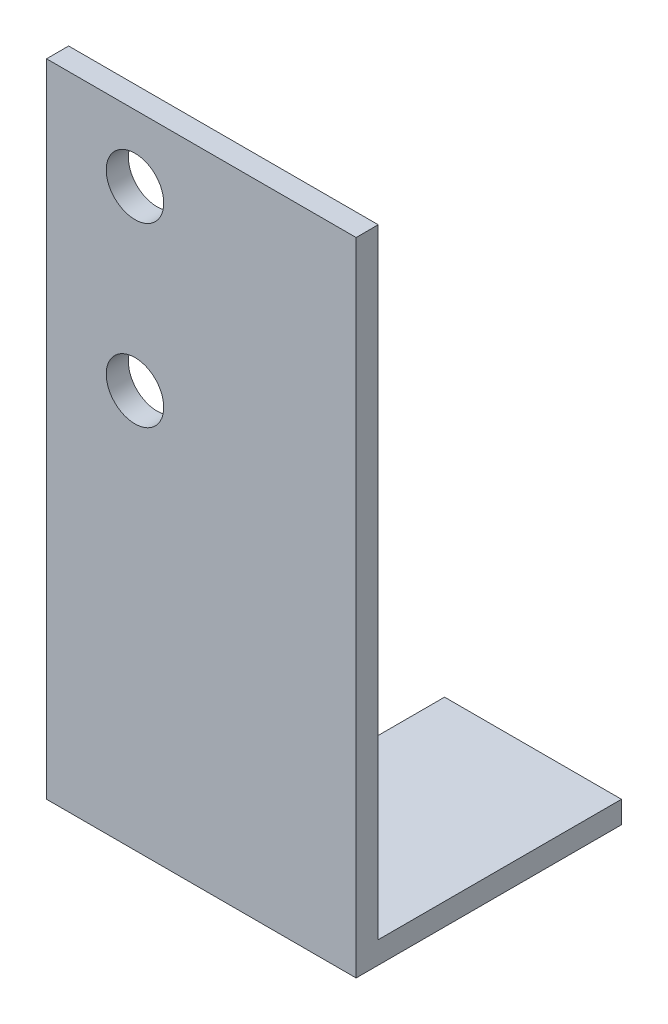
ISO-10303-21;
HEADER;
FILE_DESCRIPTION(('STEP AP214'),'2;1');
FILE_NAME('part.step','',(''),(''),'','','');
FILE_SCHEMA(('AUTOMOTIVE_DESIGN { 1 0 10303 214 1 1 1 1 }'));
ENDSEC;
DATA;
#1=APPLICATION_CONTEXT('core data for automotive mechanical design processes');
#2=APPLICATION_PROTOCOL_DEFINITION('international standard','automotive_design',2000,#1);
#3=PRODUCT_CONTEXT('',#1,'mechanical');
#4=PRODUCT('Part','Part','',(#3));
#5=PRODUCT_RELATED_PRODUCT_CATEGORY('part','',(#4));
#6=PRODUCT_DEFINITION_FORMATION('','',#4);
#7=PRODUCT_DEFINITION_CONTEXT('part definition',#1,'design');
#8=PRODUCT_DEFINITION('design','',#6,#7);
#9=PRODUCT_DEFINITION_SHAPE('','',#8);
#10=(LENGTH_UNIT() NAMED_UNIT(*) SI_UNIT(.MILLI.,.METRE.));
#11=(NAMED_UNIT(*) PLANE_ANGLE_UNIT() SI_UNIT($,.RADIAN.));
#12=(NAMED_UNIT(*) SI_UNIT($,.STERADIAN.) SOLID_ANGLE_UNIT());
#13=UNCERTAINTY_MEASURE_WITH_UNIT(LENGTH_MEASURE(1.E-05),#10,'distance_accuracy_value','');
#14=(GEOMETRIC_REPRESENTATION_CONTEXT(3) GLOBAL_UNCERTAINTY_ASSIGNED_CONTEXT((#13)) GLOBAL_UNIT_ASSIGNED_CONTEXT((#10,
#11,#12)) REPRESENTATION_CONTEXT('',''));
#15=CARTESIAN_POINT('',(0.,0.,0.));
#16=DIRECTION('',(0.,0.,1.));
#17=DIRECTION('',(1.,0.,0.));
#18=AXIS2_PLACEMENT_3D('',#15,#16,#17);
#19=CARTESIAN_POINT('',(14.,29.,0.));
#20=DIRECTION('',(0.,0.,-1.));
#21=DIRECTION('',(0.,1.,0.));
#22=AXIS2_PLACEMENT_3D('',#19,#20,#21);
#23=PLANE('',#22);
#24=CARTESIAN_POINT('',(4.,18.,0.));
#25=DIRECTION('',(0.,0.,1.));
#26=DIRECTION('',(1.,0.,0.));
#27=AXIS2_PLACEMENT_3D('',#24,#25,#26);
#28=CIRCLE('',#27,1.3);
#29=CARTESIAN_POINT('',(5.3,18.,0.));
#30=VERTEX_POINT('',#29);
#31=EDGE_CURVE('E144',#30,#30,#28,.T.);
#32=ORIENTED_EDGE('',*,*,#31,.F.);
#33=EDGE_LOOP('',(#32));
#34=FACE_BOUND('',#33,.T.);
#35=CARTESIAN_POINT('',(4.,26.,0.));
#36=DIRECTION('',(0.,0.,1.));
#37=DIRECTION('',(1.,0.,0.));
#38=AXIS2_PLACEMENT_3D('',#35,#36,#37);
#39=CIRCLE('',#38,1.3);
#40=CARTESIAN_POINT('',(5.3,26.,0.));
#41=VERTEX_POINT('',#40);
#42=EDGE_CURVE('E136',#41,#41,#39,.T.);
#43=ORIENTED_EDGE('',*,*,#42,.F.);
#44=EDGE_LOOP('',(#43));
#45=FACE_BOUND('',#44,.T.);
#46=DIRECTION('',(0.,-1.,0.));
#47=VECTOR('',#46,1.);
#48=CARTESIAN_POINT('',(0.,29.,0.));
#49=LINE('',#48,#47);
#50=CARTESIAN_POINT('',(0.,29.,0.));
#51=VERTEX_POINT('',#50);
#52=CARTESIAN_POINT('',(0.,0.,0.));
#53=VERTEX_POINT('',#52);
#54=EDGE_CURVE('E121',#51,#53,#49,.T.);
#55=ORIENTED_EDGE('',*,*,#54,.T.);
#56=DIRECTION('',(-1.,0.,0.));
#57=VECTOR('',#56,1.);
#58=CARTESIAN_POINT('',(14.,0.,0.));
#59=LINE('',#58,#57);
#60=CARTESIAN_POINT('',(14.,0.,0.));
#61=VERTEX_POINT('',#60);
#62=EDGE_CURVE('E11',#61,#53,#59,.T.);
#63=ORIENTED_EDGE('',*,*,#62,.F.);
#64=DIRECTION('',(0.,-1.,0.));
#65=VECTOR('',#64,1.);
#66=CARTESIAN_POINT('',(14.,29.,0.));
#67=LINE('',#66,#65);
#68=CARTESIAN_POINT('',(14.,29.,0.));
#69=VERTEX_POINT('',#68);
#70=EDGE_CURVE('E130',#69,#61,#67,.T.);
#71=ORIENTED_EDGE('',*,*,#70,.F.);
#72=DIRECTION('',(-1.,0.,0.));
#73=VECTOR('',#72,1.);
#74=CARTESIAN_POINT('',(14.,29.,0.));
#75=LINE('',#74,#73);
#76=EDGE_CURVE('E117',#69,#51,#75,.T.);
#77=ORIENTED_EDGE('',*,*,#76,.T.);
#78=EDGE_LOOP('',(#55,#63,#71,#77));
#79=FACE_BOUND('',#78,.T.);
#80=ADVANCED_FACE('F33',(#34,#45,#79),#23,.F.);
#81=CARTESIAN_POINT('',(14.,0.,0.));
#82=DIRECTION('',(0.,1.,0.));
#83=DIRECTION('',(0.,0.,1.));
#84=AXIS2_PLACEMENT_3D('',#81,#82,#83);
#85=PLANE('',#84);
#86=DIRECTION('',(1.,0.,0.));
#87=VECTOR('',#86,1.);
#88=CARTESIAN_POINT('',(0.,0.,-1.));
#89=LINE('',#88,#87);
#90=CARTESIAN_POINT('',(0.,0.,-1.));
#91=VERTEX_POINT('',#90);
#92=CARTESIAN_POINT('',(6.,0.,-1.));
#93=VERTEX_POINT('',#92);
#94=EDGE_CURVE('E172',#91,#93,#89,.T.);
#95=ORIENTED_EDGE('',*,*,#94,.T.);
#96=DIRECTION('',(0.,0.,-1.));
#97=VECTOR('',#96,1.);
#98=CARTESIAN_POINT('',(6.,0.,-12.));
#99=LINE('',#98,#97);
#100=CARTESIAN_POINT('',(6.,0.,-12.));
#101=VERTEX_POINT('',#100);
#102=EDGE_CURVE('E155',#93,#101,#99,.T.);
#103=ORIENTED_EDGE('',*,*,#102,.T.);
#104=DIRECTION('',(-1.,0.,0.));
#105=VECTOR('',#104,1.);
#106=CARTESIAN_POINT('',(14.,0.,-12.));
#107=LINE('',#106,#105);
#108=CARTESIAN_POINT('',(14.,0.,-12.));
#109=VERTEX_POINT('',#108);
#110=EDGE_CURVE('E41',#109,#101,#107,.T.);
#111=ORIENTED_EDGE('',*,*,#110,.F.);
#112=DIRECTION('',(0.,0.,-1.));
#113=VECTOR('',#112,1.);
#114=CARTESIAN_POINT('',(14.,0.,0.));
#115=LINE('',#114,#113);
#116=EDGE_CURVE('E81',#61,#109,#115,.T.);
#117=ORIENTED_EDGE('',*,*,#116,.F.);
#118=ORIENTED_EDGE('',*,*,#62,.T.);
#119=DIRECTION('',(0.,0.,-1.));
#120=VECTOR('',#119,1.);
#121=CARTESIAN_POINT('',(0.,0.,0.));
#122=LINE('',#121,#120);
#123=EDGE_CURVE('E124',#53,#91,#122,.T.);
#124=ORIENTED_EDGE('',*,*,#123,.T.);
#125=EDGE_LOOP('',(#95,#103,#111,#117,#118,#124));
#126=FACE_BOUND('',#125,.T.);
#127=ADVANCED_FACE('F153',(#126),#85,.F.);
#128=CARTESIAN_POINT('',(14.,0.,-12.));
#129=DIRECTION('',(0.,0.,1.));
#130=DIRECTION('',(1.,0.,0.));
#131=AXIS2_PLACEMENT_3D('',#128,#129,#130);
#132=PLANE('',#131);
#133=ORIENTED_EDGE('',*,*,#110,.T.);
#134=DIRECTION('',(0.,1.,0.));
#135=VECTOR('',#134,1.);
#136=CARTESIAN_POINT('',(6.,0.,-12.));
#137=LINE('',#136,#135);
#138=CARTESIAN_POINT('',(6.,1.,-12.));
#139=VERTEX_POINT('',#138);
#140=EDGE_CURVE('E160',#101,#139,#137,.T.);
#141=ORIENTED_EDGE('',*,*,#140,.T.);
#142=DIRECTION('',(-1.,0.,0.));
#143=VECTOR('',#142,1.);
#144=CARTESIAN_POINT('',(14.,1.,-12.));
#145=LINE('',#144,#143);
#146=CARTESIAN_POINT('',(14.,1.,-12.));
#147=VERTEX_POINT('',#146);
#148=EDGE_CURVE('E112',#147,#139,#145,.T.);
#149=ORIENTED_EDGE('',*,*,#148,.F.);
#150=DIRECTION('',(0.,1.,0.));
#151=VECTOR('',#150,1.);
#152=CARTESIAN_POINT('',(14.,0.,-12.));
#153=LINE('',#152,#151);
#154=EDGE_CURVE('E98',#109,#147,#153,.T.);
#155=ORIENTED_EDGE('',*,*,#154,.F.);
#156=EDGE_LOOP('',(#133,#141,#149,#155));
#157=FACE_BOUND('',#156,.T.);
#158=ADVANCED_FACE('F158',(#157),#132,.F.);
#159=CARTESIAN_POINT('',(14.,1.,-12.));
#160=DIRECTION('',(0.,-1.,0.));
#161=DIRECTION('',(0.,0.,-1.));
#162=AXIS2_PLACEMENT_3D('',#159,#160,#161);
#163=PLANE('',#162);
#164=ORIENTED_EDGE('',*,*,#148,.T.);
#165=DIRECTION('',(0.,0.,-1.));
#166=VECTOR('',#165,1.);
#167=CARTESIAN_POINT('',(6.,1.,-12.));
#168=LINE('',#167,#166);
#169=CARTESIAN_POINT('',(6.,0.999999999999999,-1.));
#170=VERTEX_POINT('',#169);
#171=EDGE_CURVE('E109',#170,#139,#168,.T.);
#172=ORIENTED_EDGE('',*,*,#171,.F.);
#173=DIRECTION('',(-1.,0.,0.));
#174=VECTOR('',#173,1.);
#175=CARTESIAN_POINT('',(14.,0.999999999999999,-1.));
#176=LINE('',#175,#174);
#177=CARTESIAN_POINT('',(14.,0.999999999999999,-1.));
#178=VERTEX_POINT('',#177);
#179=EDGE_CURVE('E105',#178,#170,#176,.T.);
#180=ORIENTED_EDGE('',*,*,#179,.F.);
#181=DIRECTION('',(0.,0.,1.));
#182=VECTOR('',#181,1.);
#183=CARTESIAN_POINT('',(14.,1.,-12.));
#184=LINE('',#183,#182);
#185=EDGE_CURVE('E91',#147,#178,#184,.T.);
#186=ORIENTED_EDGE('',*,*,#185,.F.);
#187=EDGE_LOOP('',(#164,#172,#180,#186));
#188=FACE_BOUND('',#187,.T.);
#189=ADVANCED_FACE('F106',(#188),#163,.F.);
#190=CARTESIAN_POINT('',(14.,0.999999999999999,-1.));
#191=DIRECTION('',(0.,0.,1.));
#192=DIRECTION('',(0.,-1.,0.));
#193=AXIS2_PLACEMENT_3D('',#190,#191,#192);
#194=PLANE('',#193);
#195=CARTESIAN_POINT('',(4.,18.,-1.));
#196=DIRECTION('',(0.,0.,1.));
#197=DIRECTION('',(0.,-1.,0.));
#198=AXIS2_PLACEMENT_3D('',#195,#196,#197);
#199=CIRCLE('',#198,1.3);
#200=CARTESIAN_POINT('',(4.,16.7,-1.));
#201=VERTEX_POINT('',#200);
#202=EDGE_CURVE('E36',#201,#201,#199,.T.);
#203=ORIENTED_EDGE('',*,*,#202,.T.);
#204=EDGE_LOOP('',(#203));
#205=FACE_BOUND('',#204,.T.);
#206=CARTESIAN_POINT('',(4.,26.,-1.));
#207=DIRECTION('',(0.,0.,1.));
#208=DIRECTION('',(0.,-1.,0.));
#209=AXIS2_PLACEMENT_3D('',#206,#207,#208);
#210=CIRCLE('',#209,1.3);
#211=CARTESIAN_POINT('',(4.,24.7,-1.));
#212=VERTEX_POINT('',#211);
#213=EDGE_CURVE('E125',#212,#212,#210,.T.);
#214=ORIENTED_EDGE('',*,*,#213,.T.);
#215=EDGE_LOOP('',(#214));
#216=FACE_BOUND('',#215,.T.);
#217=DIRECTION('',(0.,1.,0.));
#218=VECTOR('',#217,1.);
#219=CARTESIAN_POINT('',(0.,0.999999999999999,-1.));
#220=LINE('',#219,#218);
#221=CARTESIAN_POINT('',(0.,29.,-1.));
#222=VERTEX_POINT('',#221);
#223=EDGE_CURVE('E49',#91,#222,#220,.T.);
#224=ORIENTED_EDGE('',*,*,#223,.T.);
#225=DIRECTION('',(-1.,0.,0.));
#226=VECTOR('',#225,1.);
#227=CARTESIAN_POINT('',(14.,29.,-1.));
#228=LINE('',#227,#226);
#229=CARTESIAN_POINT('',(14.,29.,-1.));
#230=VERTEX_POINT('',#229);
#231=EDGE_CURVE('E113',#230,#222,#228,.T.);
#232=ORIENTED_EDGE('',*,*,#231,.F.);
#233=DIRECTION('',(0.,1.,0.));
#234=VECTOR('',#233,1.);
#235=CARTESIAN_POINT('',(14.,0.999999999999999,-1.));
#236=LINE('',#235,#234);
#237=EDGE_CURVE('E95',#178,#230,#236,.T.);
#238=ORIENTED_EDGE('',*,*,#237,.F.);
#239=ORIENTED_EDGE('',*,*,#179,.T.);
#240=DIRECTION('',(0.,1.,0.));
#241=VECTOR('',#240,1.);
#242=CARTESIAN_POINT('',(6.,0.,-1.));
#243=LINE('',#242,#241);
#244=EDGE_CURVE('E165',#93,#170,#243,.T.);
#245=ORIENTED_EDGE('',*,*,#244,.F.);
#246=ORIENTED_EDGE('',*,*,#94,.F.);
#247=EDGE_LOOP('',(#224,#232,#238,#239,#245,#246));
#248=FACE_BOUND('',#247,.T.);
#249=ADVANCED_FACE('F115',(#205,#216,#248),#194,.F.);
#250=CARTESIAN_POINT('',(14.,29.,-1.));
#251=DIRECTION('',(0.,-1.,0.));
#252=DIRECTION('',(0.,0.,-1.));
#253=AXIS2_PLACEMENT_3D('',#250,#251,#252);
#254=PLANE('',#253);
#255=DIRECTION('',(0.,0.,1.));
#256=VECTOR('',#255,1.);
#257=CARTESIAN_POINT('',(0.,29.,-1.));
#258=LINE('',#257,#256);
#259=EDGE_CURVE('E73',#222,#51,#258,.T.);
#260=ORIENTED_EDGE('',*,*,#259,.T.);
#261=ORIENTED_EDGE('',*,*,#76,.F.);
#262=DIRECTION('',(0.,0.,1.));
#263=VECTOR('',#262,1.);
#264=CARTESIAN_POINT('',(14.,29.,-1.));
#265=LINE('',#264,#263);
#266=EDGE_CURVE('E58',#230,#69,#265,.T.);
#267=ORIENTED_EDGE('',*,*,#266,.F.);
#268=ORIENTED_EDGE('',*,*,#231,.T.);
#269=EDGE_LOOP('',(#260,#261,#267,#268));
#270=FACE_BOUND('',#269,.T.);
#271=ADVANCED_FACE('F174',(#270),#254,.F.);
#272=CARTESIAN_POINT('',(14.,0.,0.));
#273=DIRECTION('',(1.,0.,0.));
#274=DIRECTION('',(0.,0.,-1.));
#275=AXIS2_PLACEMENT_3D('',#272,#273,#274);
#276=PLANE('',#275);
#277=ORIENTED_EDGE('',*,*,#70,.T.);
#278=ORIENTED_EDGE('',*,*,#116,.T.);
#279=ORIENTED_EDGE('',*,*,#154,.T.);
#280=ORIENTED_EDGE('',*,*,#185,.T.);
#281=ORIENTED_EDGE('',*,*,#237,.T.);
#282=ORIENTED_EDGE('',*,*,#266,.T.);
#283=EDGE_LOOP('',(#277,#278,#279,#280,#281,#282));
#284=FACE_BOUND('',#283,.T.);
#285=ADVANCED_FACE('F93',(#284),#276,.T.);
#286=CARTESIAN_POINT('',(0.,0.,0.));
#287=DIRECTION('',(1.,0.,0.));
#288=DIRECTION('',(0.,0.,-1.));
#289=AXIS2_PLACEMENT_3D('',#286,#287,#288);
#290=PLANE('',#289);
#291=ORIENTED_EDGE('',*,*,#223,.F.);
#292=ORIENTED_EDGE('',*,*,#123,.F.);
#293=ORIENTED_EDGE('',*,*,#54,.F.);
#294=ORIENTED_EDGE('',*,*,#259,.F.);
#295=EDGE_LOOP('',(#291,#292,#293,#294));
#296=FACE_BOUND('',#295,.T.);
#297=ADVANCED_FACE('F176',(#296),#290,.F.);
#298=CARTESIAN_POINT('',(4.,26.,-12.));
#299=DIRECTION('',(0.,0.,1.));
#300=DIRECTION('',(1.,0.,0.));
#301=AXIS2_PLACEMENT_3D('',#298,#299,#300);
#302=CYLINDRICAL_SURFACE('',#301,1.3);
#303=ORIENTED_EDGE('',*,*,#42,.T.);
#304=EDGE_LOOP('',(#303));
#305=FACE_BOUND('',#304,.T.);
#306=ORIENTED_EDGE('',*,*,#213,.F.);
#307=EDGE_LOOP('',(#306));
#308=FACE_BOUND('',#307,.T.);
#309=ADVANCED_FACE('F189',(#305,#308),#302,.F.);
#310=CARTESIAN_POINT('',(4.,18.,-12.));
#311=DIRECTION('',(0.,0.,1.));
#312=DIRECTION('',(1.,0.,0.));
#313=AXIS2_PLACEMENT_3D('',#310,#311,#312);
#314=CYLINDRICAL_SURFACE('',#313,1.3);
#315=ORIENTED_EDGE('',*,*,#31,.T.);
#316=EDGE_LOOP('',(#315));
#317=FACE_BOUND('',#316,.T.);
#318=ORIENTED_EDGE('',*,*,#202,.F.);
#319=EDGE_LOOP('',(#318));
#320=FACE_BOUND('',#319,.T.);
#321=ADVANCED_FACE('F186',(#317,#320),#314,.F.);
#322=CARTESIAN_POINT('',(6.,0.,-12.));
#323=DIRECTION('',(1.,0.,0.));
#324=DIRECTION('',(0.,0.,-1.));
#325=AXIS2_PLACEMENT_3D('',#322,#323,#324);
#326=PLANE('',#325);
#327=ORIENTED_EDGE('',*,*,#171,.T.);
#328=ORIENTED_EDGE('',*,*,#140,.F.);
#329=ORIENTED_EDGE('',*,*,#102,.F.);
#330=ORIENTED_EDGE('',*,*,#244,.T.);
#331=EDGE_LOOP('',(#327,#328,#329,#330));
#332=FACE_BOUND('',#331,.T.);
#333=ADVANCED_FACE('F167',(#332),#326,.F.);
#334=CLOSED_SHELL('',(#80,#127,#158,#189,#249,#271,#285,#297,#309,#321,#333));
#335=MANIFOLD_SOLID_BREP('B2',#334);
#336=ADVANCED_BREP_SHAPE_REPRESENTATION('',(#18,#335),#14);
#337=SHAPE_DEFINITION_REPRESENTATION(#9,#336);
ENDSEC;
END-ISO-10303-21;
